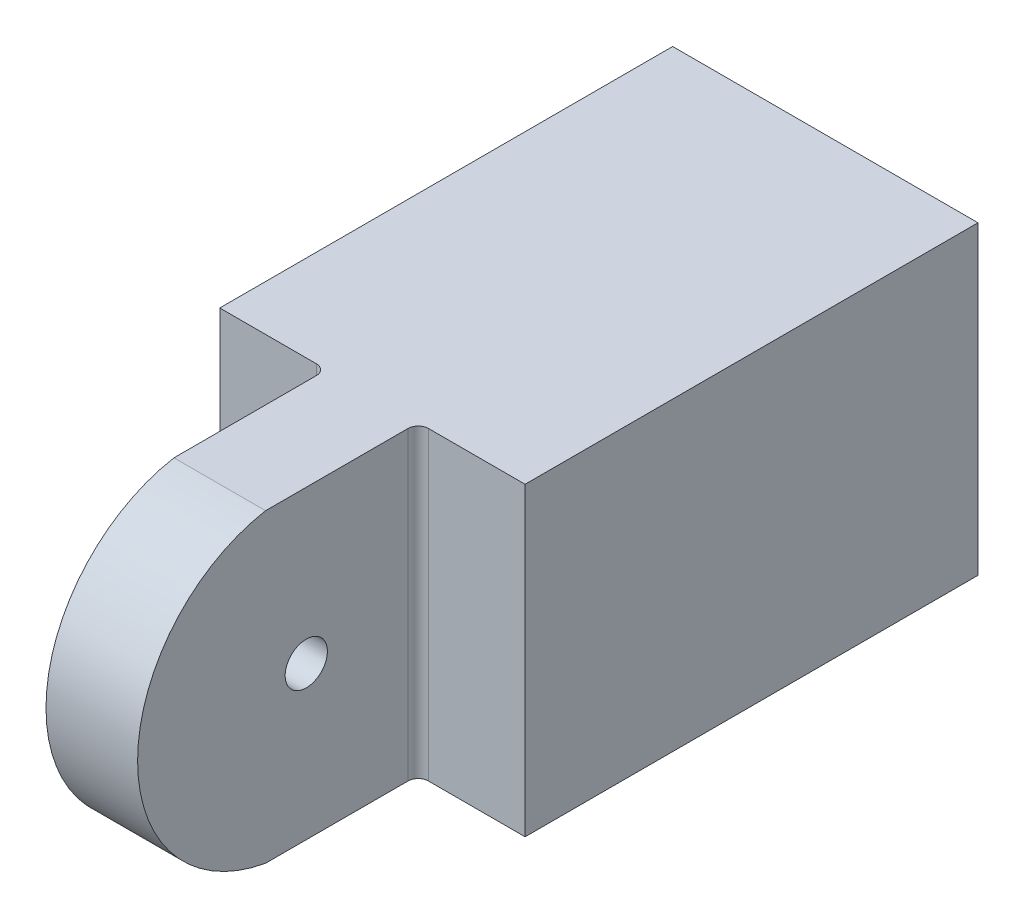
ISO-10303-21;
HEADER;
FILE_DESCRIPTION(('STEP AP214'),'2;1');
FILE_NAME('part.step','',(''),(''),'','','');
FILE_SCHEMA(('AUTOMOTIVE_DESIGN { 1 0 10303 214 1 1 1 1 }'));
ENDSEC;
DATA;
#1=APPLICATION_CONTEXT('core data for automotive mechanical design processes');
#2=APPLICATION_PROTOCOL_DEFINITION('international standard','automotive_design',2000,#1);
#3=PRODUCT_CONTEXT('',#1,'mechanical');
#4=PRODUCT('Part','Part','',(#3));
#5=PRODUCT_RELATED_PRODUCT_CATEGORY('part','',(#4));
#6=PRODUCT_DEFINITION_FORMATION('','',#4);
#7=PRODUCT_DEFINITION_CONTEXT('part definition',#1,'design');
#8=PRODUCT_DEFINITION('design','',#6,#7);
#9=PRODUCT_DEFINITION_SHAPE('','',#8);
#10=(LENGTH_UNIT() NAMED_UNIT(*) SI_UNIT(.MILLI.,.METRE.));
#11=(NAMED_UNIT(*) PLANE_ANGLE_UNIT() SI_UNIT($,.RADIAN.));
#12=(NAMED_UNIT(*) SI_UNIT($,.STERADIAN.) SOLID_ANGLE_UNIT());
#13=UNCERTAINTY_MEASURE_WITH_UNIT(LENGTH_MEASURE(1.E-05),#10,'distance_accuracy_value','');
#14=(GEOMETRIC_REPRESENTATION_CONTEXT(3) GLOBAL_UNCERTAINTY_ASSIGNED_CONTEXT((#13)) GLOBAL_UNIT_ASSIGNED_CONTEXT((#10,
#11,#12)) REPRESENTATION_CONTEXT('',''));
#15=CARTESIAN_POINT('',(0.,0.,0.));
#16=DIRECTION('',(0.,0.,1.));
#17=DIRECTION('',(1.,0.,0.));
#18=AXIS2_PLACEMENT_3D('',#15,#16,#17);
#19=CARTESIAN_POINT('',(0.,0.,0.));
#20=DIRECTION('',(0.,0.,1.));
#21=DIRECTION('',(1.,0.,0.));
#22=AXIS2_PLACEMENT_3D('',#19,#20,#21);
#23=PLANE('',#22);
#24=DIRECTION('',(0.,1.,0.));
#25=VECTOR('',#24,1.);
#26=CARTESIAN_POINT('',(30.,30.,0.));
#27=LINE('',#26,#25);
#28=CARTESIAN_POINT('',(30.,-30.,0.));
#29=VERTEX_POINT('',#28);
#30=CARTESIAN_POINT('',(30.,30.,0.));
#31=VERTEX_POINT('',#30);
#32=EDGE_CURVE('E203',#29,#31,#27,.T.);
#33=ORIENTED_EDGE('',*,*,#32,.F.);
#34=DIRECTION('',(1.,0.,0.));
#35=VECTOR('',#34,1.);
#36=CARTESIAN_POINT('',(-30.,-30.,0.));
#37=LINE('',#36,#35);
#38=CARTESIAN_POINT('',(-30.,-30.,0.));
#39=VERTEX_POINT('',#38);
#40=EDGE_CURVE('E209',#39,#29,#37,.T.);
#41=ORIENTED_EDGE('',*,*,#40,.F.);
#42=DIRECTION('',(0.,-1.,0.));
#43=VECTOR('',#42,1.);
#44=CARTESIAN_POINT('',(-30.,30.,0.));
#45=LINE('',#44,#43);
#46=CARTESIAN_POINT('',(-30.,30.,0.));
#47=VERTEX_POINT('',#46);
#48=EDGE_CURVE('E228',#47,#39,#45,.T.);
#49=ORIENTED_EDGE('',*,*,#48,.F.);
#50=DIRECTION('',(-1.,0.,0.));
#51=VECTOR('',#50,1.);
#52=CARTESIAN_POINT('',(-30.,30.,0.));
#53=LINE('',#52,#51);
#54=EDGE_CURVE('E225',#31,#47,#53,.T.);
#55=ORIENTED_EDGE('',*,*,#54,.F.);
#56=EDGE_LOOP('',(#33,#41,#49,#55));
#57=FACE_BOUND('',#56,.T.);
#58=DIRECTION('',(-1.,0.,0.));
#59=VECTOR('',#58,1.);
#60=CARTESIAN_POINT('',(25.,25.,0.));
#61=LINE('',#60,#59);
#62=CARTESIAN_POINT('',(25.,25.,0.));
#63=VERTEX_POINT('',#62);
#64=CARTESIAN_POINT('',(-25.,25.,0.));
#65=VERTEX_POINT('',#64);
#66=EDGE_CURVE('E56',#63,#65,#61,.T.);
#67=ORIENTED_EDGE('',*,*,#66,.T.);
#68=DIRECTION('',(0.,-1.,0.));
#69=VECTOR('',#68,1.);
#70=CARTESIAN_POINT('',(-25.,25.,0.));
#71=LINE('',#70,#69);
#72=CARTESIAN_POINT('',(-25.,-25.,0.));
#73=VERTEX_POINT('',#72);
#74=EDGE_CURVE('E163',#65,#73,#71,.T.);
#75=ORIENTED_EDGE('',*,*,#74,.T.);
#76=DIRECTION('',(-1.,0.,0.));
#77=VECTOR('',#76,1.);
#78=CARTESIAN_POINT('',(25.,-25.,0.));
#79=LINE('',#78,#77);
#80=CARTESIAN_POINT('',(25.,-25.,0.));
#81=VERTEX_POINT('',#80);
#82=EDGE_CURVE('E323',#81,#73,#79,.T.);
#83=ORIENTED_EDGE('',*,*,#82,.F.);
#84=DIRECTION('',(0.,-1.,0.));
#85=VECTOR('',#84,1.);
#86=CARTESIAN_POINT('',(25.,25.,0.));
#87=LINE('',#86,#85);
#88=EDGE_CURVE('E159',#63,#81,#87,.T.);
#89=ORIENTED_EDGE('',*,*,#88,.F.);
#90=EDGE_LOOP('',(#67,#75,#83,#89));
#91=FACE_BOUND('',#90,.T.);
#92=ADVANCED_FACE('F39',(#57,#91),#23,.F.);
#93=CARTESIAN_POINT('',(0.,0.,89.));
#94=DIRECTION('',(0.,0.,1.));
#95=DIRECTION('',(1.,0.,0.));
#96=AXIS2_PLACEMENT_3D('',#93,#94,#95);
#97=PLANE('',#96);
#98=DIRECTION('',(1.,0.,0.));
#99=VECTOR('',#98,1.);
#100=CARTESIAN_POINT('',(-30.,-30.,89.));
#101=LINE('',#100,#99);
#102=CARTESIAN_POINT('',(-30.,-30.,89.));
#103=VERTEX_POINT('',#102);
#104=CARTESIAN_POINT('',(-11.,-30.,89.));
#105=VERTEX_POINT('',#104);
#106=EDGE_CURVE('E218',#103,#105,#101,.T.);
#107=ORIENTED_EDGE('',*,*,#106,.T.);
#108=DIRECTION('',(0.,-1.,0.));
#109=VECTOR('',#108,1.);
#110=CARTESIAN_POINT('',(-11.,0.,89.));
#111=LINE('',#110,#109);
#112=CARTESIAN_POINT('',(-11.,30.,89.));
#113=VERTEX_POINT('',#112);
#114=EDGE_CURVE('E259',#105,#113,#111,.F.);
#115=ORIENTED_EDGE('',*,*,#114,.T.);
#116=DIRECTION('',(-1.,0.,0.));
#117=VECTOR('',#116,1.);
#118=CARTESIAN_POINT('',(-30.,30.,89.));
#119=LINE('',#118,#117);
#120=CARTESIAN_POINT('',(-30.,30.,89.));
#121=VERTEX_POINT('',#120);
#122=EDGE_CURVE('E208',#113,#121,#119,.T.);
#123=ORIENTED_EDGE('',*,*,#122,.T.);
#124=DIRECTION('',(0.,-1.,0.));
#125=VECTOR('',#124,1.);
#126=CARTESIAN_POINT('',(-30.,30.,89.));
#127=LINE('',#126,#125);
#128=EDGE_CURVE('E214',#121,#103,#127,.T.);
#129=ORIENTED_EDGE('',*,*,#128,.T.);
#130=EDGE_LOOP('',(#107,#115,#123,#129));
#131=FACE_BOUND('',#130,.T.);
#132=ADVANCED_FACE('F274',(#131),#97,.T.);
#133=CARTESIAN_POINT('',(30.,30.,89.));
#134=DIRECTION('',(-1.,0.,0.));
#135=DIRECTION('',(0.,-1.,0.));
#136=AXIS2_PLACEMENT_3D('',#133,#134,#135);
#137=PLANE('',#136);
#138=ORIENTED_EDGE('',*,*,#32,.T.);
#139=DIRECTION('',(0.,0.,-1.));
#140=VECTOR('',#139,1.);
#141=CARTESIAN_POINT('',(30.,30.,89.));
#142=LINE('',#141,#140);
#143=CARTESIAN_POINT('',(30.,30.,89.));
#144=VERTEX_POINT('',#143);
#145=EDGE_CURVE('E244',#144,#31,#142,.T.);
#146=ORIENTED_EDGE('',*,*,#145,.F.);
#147=DIRECTION('',(0.,1.,0.));
#148=VECTOR('',#147,1.);
#149=CARTESIAN_POINT('',(30.,30.,89.));
#150=LINE('',#149,#148);
#151=CARTESIAN_POINT('',(30.,-30.,89.));
#152=VERTEX_POINT('',#151);
#153=EDGE_CURVE('E204',#152,#144,#150,.T.);
#154=ORIENTED_EDGE('',*,*,#153,.F.);
#155=DIRECTION('',(0.,0.,-1.));
#156=VECTOR('',#155,1.);
#157=CARTESIAN_POINT('',(30.,-30.,89.));
#158=LINE('',#157,#156);
#159=EDGE_CURVE('E221',#152,#29,#158,.T.);
#160=ORIENTED_EDGE('',*,*,#159,.T.);
#161=EDGE_LOOP('',(#138,#146,#154,#160));
#162=FACE_BOUND('',#161,.T.);
#163=ADVANCED_FACE('F310',(#162),#137,.F.);
#164=CARTESIAN_POINT('',(-30.,30.,89.));
#165=DIRECTION('',(0.,-1.,0.));
#166=DIRECTION('',(0.,0.,-1.));
#167=AXIS2_PLACEMENT_3D('',#164,#165,#166);
#168=PLANE('',#167);
#169=ORIENTED_EDGE('',*,*,#54,.T.);
#170=DIRECTION('',(0.,0.,-1.));
#171=VECTOR('',#170,1.);
#172=CARTESIAN_POINT('',(-30.,30.,89.));
#173=LINE('',#172,#171);
#174=EDGE_CURVE('E240',#121,#47,#173,.T.);
#175=ORIENTED_EDGE('',*,*,#174,.F.);
#176=ORIENTED_EDGE('',*,*,#122,.F.);
#177=CARTESIAN_POINT('',(-11.,30.,91.));
#178=DIRECTION('',(0.,-1.,0.));
#179=DIRECTION('',(0.,0.,-1.));
#180=AXIS2_PLACEMENT_3D('',#177,#178,#179);
#181=CIRCLE('',#180,2.);
#182=CARTESIAN_POINT('',(-9.,30.,91.));
#183=VERTEX_POINT('',#182);
#184=EDGE_CURVE('E11',#113,#183,#181,.T.);
#185=ORIENTED_EDGE('',*,*,#184,.T.);
#186=DIRECTION('',(0.,0.,-1.));
#187=VECTOR('',#186,1.);
#188=CARTESIAN_POINT('',(-9.,30.,119.));
#189=LINE('',#188,#187);
#190=CARTESIAN_POINT('',(-9.,30.,119.));
#191=VERTEX_POINT('',#190);
#192=EDGE_CURVE('E188',#191,#183,#189,.T.);
#193=ORIENTED_EDGE('',*,*,#192,.F.);
#194=DIRECTION('',(-1.,0.,0.));
#195=VECTOR('',#194,1.);
#196=CARTESIAN_POINT('',(9.,30.,119.));
#197=LINE('',#196,#195);
#198=CARTESIAN_POINT('',(9.,30.,119.));
#199=VERTEX_POINT('',#198);
#200=EDGE_CURVE('E184',#199,#191,#197,.T.);
#201=ORIENTED_EDGE('',*,*,#200,.F.);
#202=DIRECTION('',(0.,0.,-1.));
#203=VECTOR('',#202,1.);
#204=CARTESIAN_POINT('',(9.,30.,119.));
#205=LINE('',#204,#203);
#206=CARTESIAN_POINT('',(9.,30.,91.));
#207=VERTEX_POINT('',#206);
#208=EDGE_CURVE('E192',#199,#207,#205,.T.);
#209=ORIENTED_EDGE('',*,*,#208,.T.);
#210=CARTESIAN_POINT('',(11.,30.,91.));
#211=DIRECTION('',(0.,-1.,0.));
#212=DIRECTION('',(0.,0.,-1.));
#213=AXIS2_PLACEMENT_3D('',#210,#211,#212);
#214=CIRCLE('',#213,2.);
#215=CARTESIAN_POINT('',(11.,30.,89.));
#216=VERTEX_POINT('',#215);
#217=EDGE_CURVE('E262',#207,#216,#214,.T.);
#218=ORIENTED_EDGE('',*,*,#217,.T.);
#219=EDGE_CURVE('E210',#144,#216,#119,.T.);
#220=ORIENTED_EDGE('',*,*,#219,.F.);
#221=ORIENTED_EDGE('',*,*,#145,.T.);
#222=EDGE_LOOP('',(#169,#175,#176,#185,#193,#201,#209,#218,#220,#221));
#223=FACE_BOUND('',#222,.T.);
#224=ADVANCED_FACE('F280',(#223),#168,.F.);
#225=CARTESIAN_POINT('',(-30.,30.,89.));
#226=DIRECTION('',(1.,0.,0.));
#227=DIRECTION('',(0.,1.,0.));
#228=AXIS2_PLACEMENT_3D('',#225,#226,#227);
#229=PLANE('',#228);
#230=ORIENTED_EDGE('',*,*,#48,.T.);
#231=DIRECTION('',(0.,0.,-1.));
#232=VECTOR('',#231,1.);
#233=CARTESIAN_POINT('',(-30.,-30.,89.));
#234=LINE('',#233,#232);
#235=EDGE_CURVE('E236',#103,#39,#234,.T.);
#236=ORIENTED_EDGE('',*,*,#235,.F.);
#237=ORIENTED_EDGE('',*,*,#128,.F.);
#238=ORIENTED_EDGE('',*,*,#174,.T.);
#239=EDGE_LOOP('',(#230,#236,#237,#238));
#240=FACE_BOUND('',#239,.T.);
#241=ADVANCED_FACE('F283',(#240),#229,.F.);
#242=CARTESIAN_POINT('',(-30.,-30.,89.));
#243=DIRECTION('',(0.,1.,0.));
#244=DIRECTION('',(0.,0.,1.));
#245=AXIS2_PLACEMENT_3D('',#242,#243,#244);
#246=PLANE('',#245);
#247=ORIENTED_EDGE('',*,*,#40,.T.);
#248=ORIENTED_EDGE('',*,*,#159,.F.);
#249=CARTESIAN_POINT('',(11.,-30.,89.));
#250=VERTEX_POINT('',#249);
#251=EDGE_CURVE('E217',#250,#152,#101,.T.);
#252=ORIENTED_EDGE('',*,*,#251,.F.);
#253=CARTESIAN_POINT('',(11.,-30.,91.));
#254=DIRECTION('',(0.,1.,0.));
#255=DIRECTION('',(0.,0.,1.));
#256=AXIS2_PLACEMENT_3D('',#253,#254,#255);
#257=CIRCLE('',#256,2.);
#258=CARTESIAN_POINT('',(9.,-30.,91.));
#259=VERTEX_POINT('',#258);
#260=EDGE_CURVE('E265',#250,#259,#257,.T.);
#261=ORIENTED_EDGE('',*,*,#260,.T.);
#262=DIRECTION('',(0.,0.,-1.));
#263=VECTOR('',#262,1.);
#264=CARTESIAN_POINT('',(9.,-30.,119.));
#265=LINE('',#264,#263);
#266=CARTESIAN_POINT('',(9.,-30.,119.));
#267=VERTEX_POINT('',#266);
#268=EDGE_CURVE('E196',#267,#259,#265,.T.);
#269=ORIENTED_EDGE('',*,*,#268,.F.);
#270=DIRECTION('',(1.,0.,0.));
#271=VECTOR('',#270,1.);
#272=CARTESIAN_POINT('',(9.,-30.,119.));
#273=LINE('',#272,#271);
#274=CARTESIAN_POINT('',(-9.,-30.,119.));
#275=VERTEX_POINT('',#274);
#276=EDGE_CURVE('E179',#275,#267,#273,.T.);
#277=ORIENTED_EDGE('',*,*,#276,.F.);
#278=DIRECTION('',(0.,0.,-1.));
#279=VECTOR('',#278,1.);
#280=CARTESIAN_POINT('',(-9.,-30.,119.));
#281=LINE('',#280,#279);
#282=CARTESIAN_POINT('',(-9.,-30.,91.));
#283=VERTEX_POINT('',#282);
#284=EDGE_CURVE('E200',#275,#283,#281,.T.);
#285=ORIENTED_EDGE('',*,*,#284,.T.);
#286=CARTESIAN_POINT('',(-11.,-30.,91.));
#287=DIRECTION('',(0.,1.,0.));
#288=DIRECTION('',(0.,0.,1.));
#289=AXIS2_PLACEMENT_3D('',#286,#287,#288);
#290=CIRCLE('',#289,2.);
#291=EDGE_CURVE('E49',#283,#105,#290,.T.);
#292=ORIENTED_EDGE('',*,*,#291,.T.);
#293=ORIENTED_EDGE('',*,*,#106,.F.);
#294=ORIENTED_EDGE('',*,*,#235,.T.);
#295=EDGE_LOOP('',(#247,#248,#252,#261,#269,#277,#285,#292,#293,#294));
#296=FACE_BOUND('',#295,.T.);
#297=ADVANCED_FACE('F285',(#296),#246,.F.);
#298=ORIENTED_EDGE('',*,*,#219,.T.);
#299=DIRECTION('',(0.,1.,0.));
#300=VECTOR('',#299,1.);
#301=CARTESIAN_POINT('',(11.,0.,89.));
#302=LINE('',#301,#300);
#303=EDGE_CURVE('E252',#216,#250,#302,.F.);
#304=ORIENTED_EDGE('',*,*,#303,.T.);
#305=ORIENTED_EDGE('',*,*,#251,.T.);
#306=ORIENTED_EDGE('',*,*,#153,.T.);
#307=EDGE_LOOP('',(#298,#304,#305,#306));
#308=FACE_BOUND('',#307,.T.);
#309=ADVANCED_FACE('F304',(#308),#97,.T.);
#310=CARTESIAN_POINT('',(-9.,-30.,119.));
#311=DIRECTION('',(1.,0.,0.));
#312=DIRECTION('',(0.,0.,-1.));
#313=AXIS2_PLACEMENT_3D('',#310,#311,#312);
#314=PLANE('',#313);
#315=CARTESIAN_POINT('',(-9.,0.,111.));
#316=DIRECTION('',(-1.,0.,0.));
#317=DIRECTION('',(0.,0.,1.));
#318=AXIS2_PLACEMENT_3D('',#315,#316,#317);
#319=CIRCLE('',#318,4.15);
#320=CARTESIAN_POINT('',(-9.,0.,115.15));
#321=VERTEX_POINT('',#320);
#322=EDGE_CURVE('E326',#321,#321,#319,.T.);
#323=ORIENTED_EDGE('',*,*,#322,.F.);
#324=EDGE_LOOP('',(#323));
#325=FACE_BOUND('',#324,.T.);
#326=ORIENTED_EDGE('',*,*,#192,.T.);
#327=DIRECTION('',(0.,-1.,0.));
#328=VECTOR('',#327,1.);
#329=CARTESIAN_POINT('',(-9.,-30.,91.));
#330=LINE('',#329,#328);
#331=EDGE_CURVE('E255',#183,#283,#330,.T.);
#332=ORIENTED_EDGE('',*,*,#331,.T.);
#333=ORIENTED_EDGE('',*,*,#284,.F.);
#334=CARTESIAN_POINT('',(-8.99999999999999,0.,113.675895734686));
#335=DIRECTION('',(1.,0.,0.));
#336=DIRECTION('',(0.,0.,1.));
#337=AXIS2_PLACEMENT_3D('',#334,#335,#336);
#338=CIRCLE('',#337,30.4687723124503);
#339=EDGE_CURVE('E171',#191,#275,#338,.T.);
#340=ORIENTED_EDGE('',*,*,#339,.F.);
#341=EDGE_LOOP('',(#326,#332,#333,#340));
#342=FACE_BOUND('',#341,.T.);
#343=ADVANCED_FACE('F290',(#325,#342),#314,.F.);
#344=CARTESIAN_POINT('',(9.,-30.,119.));
#345=DIRECTION('',(-1.,0.,0.));
#346=DIRECTION('',(0.,0.,1.));
#347=AXIS2_PLACEMENT_3D('',#344,#345,#346);
#348=PLANE('',#347);
#349=CARTESIAN_POINT('',(9.,0.,111.));
#350=DIRECTION('',(-1.,0.,0.));
#351=DIRECTION('',(0.,0.,1.));
#352=AXIS2_PLACEMENT_3D('',#349,#350,#351);
#353=CIRCLE('',#352,4.15);
#354=CARTESIAN_POINT('',(9.,0.,115.15));
#355=VERTEX_POINT('',#354);
#356=EDGE_CURVE('E43',#355,#355,#353,.T.);
#357=ORIENTED_EDGE('',*,*,#356,.T.);
#358=EDGE_LOOP('',(#357));
#359=FACE_BOUND('',#358,.T.);
#360=ORIENTED_EDGE('',*,*,#268,.T.);
#361=DIRECTION('',(0.,1.,0.));
#362=VECTOR('',#361,1.);
#363=CARTESIAN_POINT('',(9.,-30.,91.));
#364=LINE('',#363,#362);
#365=EDGE_CURVE('E248',#259,#207,#364,.T.);
#366=ORIENTED_EDGE('',*,*,#365,.T.);
#367=ORIENTED_EDGE('',*,*,#208,.F.);
#368=CARTESIAN_POINT('',(9.,0.,113.675895734686));
#369=DIRECTION('',(1.,0.,0.));
#370=DIRECTION('',(0.,0.,1.));
#371=AXIS2_PLACEMENT_3D('',#368,#369,#370);
#372=CIRCLE('',#371,30.4687723124503);
#373=EDGE_CURVE('E165',#199,#267,#372,.T.);
#374=ORIENTED_EDGE('',*,*,#373,.T.);
#375=EDGE_LOOP('',(#360,#366,#367,#374));
#376=FACE_BOUND('',#375,.T.);
#377=ADVANCED_FACE('F297',(#359,#376),#348,.F.);
#378=CARTESIAN_POINT('',(-8.99999999999999,0.,113.675895734686));
#379=DIRECTION('',(1.,0.,0.));
#380=DIRECTION('',(0.,0.,-1.));
#381=AXIS2_PLACEMENT_3D('',#378,#379,#380);
#382=CYLINDRICAL_SURFACE('',#381,30.4687723124503);
#383=ORIENTED_EDGE('',*,*,#373,.F.);
#384=ORIENTED_EDGE('',*,*,#200,.T.);
#385=ORIENTED_EDGE('',*,*,#339,.T.);
#386=ORIENTED_EDGE('',*,*,#276,.T.);
#387=EDGE_LOOP('',(#383,#384,#385,#386));
#388=FACE_BOUND('',#387,.T.);
#389=ADVANCED_FACE('F294',(#388),#382,.T.);
#390=CARTESIAN_POINT('',(11.,-30.,91.));
#391=DIRECTION('',(0.,1.,0.));
#392=DIRECTION('',(0.,0.,1.));
#393=AXIS2_PLACEMENT_3D('',#390,#391,#392);
#394=CYLINDRICAL_SURFACE('',#393,2.);
#395=ORIENTED_EDGE('',*,*,#260,.F.);
#396=ORIENTED_EDGE('',*,*,#303,.F.);
#397=ORIENTED_EDGE('',*,*,#217,.F.);
#398=ORIENTED_EDGE('',*,*,#365,.F.);
#399=EDGE_LOOP('',(#395,#396,#397,#398));
#400=FACE_BOUND('',#399,.T.);
#401=ADVANCED_FACE('F301',(#400),#394,.F.);
#402=CARTESIAN_POINT('',(-11.,-30.,91.));
#403=DIRECTION('',(0.,-1.,0.));
#404=DIRECTION('',(0.,0.,-1.));
#405=AXIS2_PLACEMENT_3D('',#402,#403,#404);
#406=CYLINDRICAL_SURFACE('',#405,2.);
#407=ORIENTED_EDGE('',*,*,#184,.F.);
#408=ORIENTED_EDGE('',*,*,#114,.F.);
#409=ORIENTED_EDGE('',*,*,#291,.F.);
#410=ORIENTED_EDGE('',*,*,#331,.F.);
#411=EDGE_LOOP('',(#407,#408,#409,#410));
#412=FACE_BOUND('',#411,.T.);
#413=ADVANCED_FACE('F41',(#412),#406,.F.);
#414=CARTESIAN_POINT('',(25.,25.,81.0000000000001));
#415=DIRECTION('',(0.,-1.,0.));
#416=DIRECTION('',(0.,0.,-1.));
#417=AXIS2_PLACEMENT_3D('',#414,#415,#416);
#418=PLANE('',#417);
#419=ORIENTED_EDGE('',*,*,#66,.F.);
#420=DIRECTION('',(0.,0.,-1.));
#421=VECTOR('',#420,1.);
#422=CARTESIAN_POINT('',(25.,25.,81.0000000000001));
#423=LINE('',#422,#421);
#424=CARTESIAN_POINT('',(25.,25.,81.0000000000001));
#425=VERTEX_POINT('',#424);
#426=EDGE_CURVE('E157',#425,#63,#423,.T.);
#427=ORIENTED_EDGE('',*,*,#426,.F.);
#428=DIRECTION('',(-1.,0.,0.));
#429=VECTOR('',#428,1.);
#430=CARTESIAN_POINT('',(25.,25.,81.0000000000001));
#431=LINE('',#430,#429);
#432=CARTESIAN_POINT('',(-25.,25.,81.0000000000001));
#433=VERTEX_POINT('',#432);
#434=EDGE_CURVE('E146',#425,#433,#431,.T.);
#435=ORIENTED_EDGE('',*,*,#434,.T.);
#436=DIRECTION('',(0.,0.,-1.));
#437=VECTOR('',#436,1.);
#438=CARTESIAN_POINT('',(-25.,25.,81.0000000000001));
#439=LINE('',#438,#437);
#440=EDGE_CURVE('E156',#433,#65,#439,.T.);
#441=ORIENTED_EDGE('',*,*,#440,.T.);
#442=EDGE_LOOP('',(#419,#427,#435,#441));
#443=FACE_BOUND('',#442,.T.);
#444=ADVANCED_FACE('F155',(#443),#418,.T.);
#445=CARTESIAN_POINT('',(-25.,25.,81.0000000000001));
#446=DIRECTION('',(1.,0.,0.));
#447=DIRECTION('',(0.,0.,-1.));
#448=AXIS2_PLACEMENT_3D('',#445,#446,#447);
#449=PLANE('',#448);
#450=ORIENTED_EDGE('',*,*,#74,.F.);
#451=ORIENTED_EDGE('',*,*,#440,.F.);
#452=DIRECTION('',(0.,-1.,0.));
#453=VECTOR('',#452,1.);
#454=CARTESIAN_POINT('',(-25.,25.,81.0000000000001));
#455=LINE('',#454,#453);
#456=CARTESIAN_POINT('',(-25.,-25.,81.0000000000001));
#457=VERTEX_POINT('',#456);
#458=EDGE_CURVE('E142',#433,#457,#455,.T.);
#459=ORIENTED_EDGE('',*,*,#458,.T.);
#460=DIRECTION('',(0.,0.,-1.));
#461=VECTOR('',#460,1.);
#462=CARTESIAN_POINT('',(-25.,-25.,81.0000000000001));
#463=LINE('',#462,#461);
#464=EDGE_CURVE('E166',#457,#73,#463,.T.);
#465=ORIENTED_EDGE('',*,*,#464,.T.);
#466=EDGE_LOOP('',(#450,#451,#459,#465));
#467=FACE_BOUND('',#466,.T.);
#468=ADVANCED_FACE('F161',(#467),#449,.T.);
#469=CARTESIAN_POINT('',(25.,-25.,81.0000000000001));
#470=DIRECTION('',(0.,-1.,0.));
#471=DIRECTION('',(0.,0.,-1.));
#472=AXIS2_PLACEMENT_3D('',#469,#470,#471);
#473=PLANE('',#472);
#474=ORIENTED_EDGE('',*,*,#82,.T.);
#475=ORIENTED_EDGE('',*,*,#464,.F.);
#476=DIRECTION('',(-1.,0.,0.));
#477=VECTOR('',#476,1.);
#478=CARTESIAN_POINT('',(25.,-25.,81.0000000000001));
#479=LINE('',#478,#477);
#480=CARTESIAN_POINT('',(25.,-25.,81.0000000000001));
#481=VERTEX_POINT('',#480);
#482=EDGE_CURVE('E149',#481,#457,#479,.T.);
#483=ORIENTED_EDGE('',*,*,#482,.F.);
#484=DIRECTION('',(0.,0.,-1.));
#485=VECTOR('',#484,1.);
#486=CARTESIAN_POINT('',(25.,-25.,81.0000000000001));
#487=LINE('',#486,#485);
#488=EDGE_CURVE('E173',#481,#81,#487,.T.);
#489=ORIENTED_EDGE('',*,*,#488,.T.);
#490=EDGE_LOOP('',(#474,#475,#483,#489));
#491=FACE_BOUND('',#490,.T.);
#492=ADVANCED_FACE('F339',(#491),#473,.F.);
#493=CARTESIAN_POINT('',(25.,25.,81.0000000000001));
#494=DIRECTION('',(1.,0.,0.));
#495=DIRECTION('',(0.,0.,-1.));
#496=AXIS2_PLACEMENT_3D('',#493,#494,#495);
#497=PLANE('',#496);
#498=ORIENTED_EDGE('',*,*,#88,.T.);
#499=ORIENTED_EDGE('',*,*,#488,.F.);
#500=DIRECTION('',(0.,-1.,0.));
#501=VECTOR('',#500,1.);
#502=CARTESIAN_POINT('',(25.,25.,81.0000000000001));
#503=LINE('',#502,#501);
#504=EDGE_CURVE('E328',#425,#481,#503,.T.);
#505=ORIENTED_EDGE('',*,*,#504,.F.);
#506=ORIENTED_EDGE('',*,*,#426,.T.);
#507=EDGE_LOOP('',(#498,#499,#505,#506));
#508=FACE_BOUND('',#507,.T.);
#509=ADVANCED_FACE('F341',(#508),#497,.F.);
#510=CARTESIAN_POINT('',(0.,0.,81.0000000000001));
#511=DIRECTION('',(0.,0.,1.));
#512=DIRECTION('',(1.,0.,0.));
#513=AXIS2_PLACEMENT_3D('',#510,#511,#512);
#514=PLANE('',#513);
#515=ORIENTED_EDGE('',*,*,#434,.F.);
#516=ORIENTED_EDGE('',*,*,#504,.T.);
#517=ORIENTED_EDGE('',*,*,#482,.T.);
#518=ORIENTED_EDGE('',*,*,#458,.F.);
#519=EDGE_LOOP('',(#515,#516,#517,#518));
#520=FACE_BOUND('',#519,.T.);
#521=ADVANCED_FACE('F144',(#520),#514,.F.);
#522=CARTESIAN_POINT('',(30.,0.,111.));
#523=DIRECTION('',(-1.,0.,0.));
#524=DIRECTION('',(0.,0.,1.));
#525=AXIS2_PLACEMENT_3D('',#522,#523,#524);
#526=CYLINDRICAL_SURFACE('',#525,4.15);
#527=ORIENTED_EDGE('',*,*,#322,.T.);
#528=EDGE_LOOP('',(#527));
#529=FACE_BOUND('',#528,.T.);
#530=ORIENTED_EDGE('',*,*,#356,.F.);
#531=EDGE_LOOP('',(#530));
#532=FACE_BOUND('',#531,.T.);
#533=ADVANCED_FACE('F349',(#529,#532),#526,.F.);
#534=CLOSED_SHELL('',(#92,#132,#163,#224,#241,#297,#309,#343,#377,#389,#401,#413,#444,#468,#492,
#509,#521,#533));
#535=MANIFOLD_SOLID_BREP('B2',#534);
#536=ADVANCED_BREP_SHAPE_REPRESENTATION('',(#18,#535),#14);
#537=SHAPE_DEFINITION_REPRESENTATION(#9,#536);
ENDSEC;
END-ISO-10303-21;
